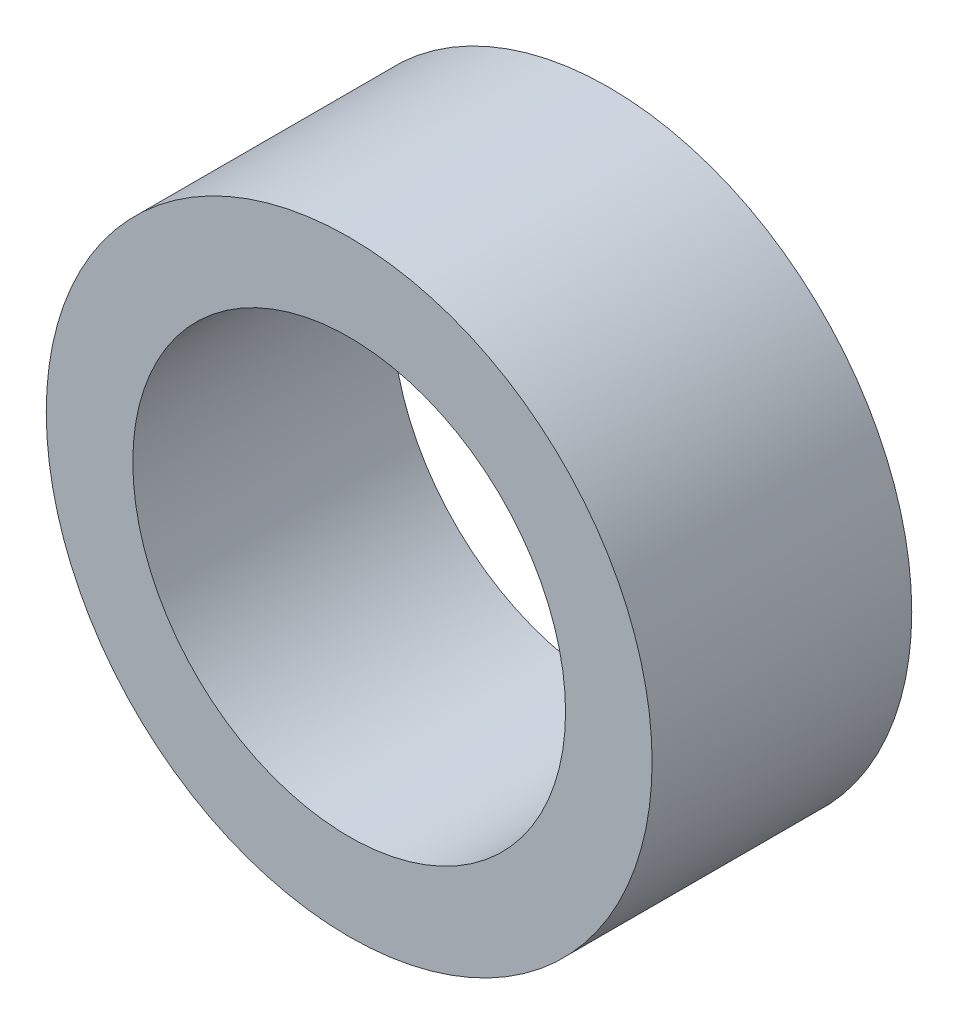
ISO-10303-21;
HEADER;
FILE_DESCRIPTION(('STEP AP214'),'2;1');
FILE_NAME('part.step','',(''),(''),'','','');
FILE_SCHEMA(('AUTOMOTIVE_DESIGN { 1 0 10303 214 1 1 1 1 }'));
ENDSEC;
DATA;
#1=APPLICATION_CONTEXT('core data for automotive mechanical design processes');
#2=APPLICATION_PROTOCOL_DEFINITION('international standard','automotive_design',2000,#1);
#3=PRODUCT_CONTEXT('',#1,'mechanical');
#4=PRODUCT('Part','Part','',(#3));
#5=PRODUCT_RELATED_PRODUCT_CATEGORY('part','',(#4));
#6=PRODUCT_DEFINITION_FORMATION('','',#4);
#7=PRODUCT_DEFINITION_CONTEXT('part definition',#1,'design');
#8=PRODUCT_DEFINITION('design','',#6,#7);
#9=PRODUCT_DEFINITION_SHAPE('','',#8);
#10=(LENGTH_UNIT() NAMED_UNIT(*) SI_UNIT(.MILLI.,.METRE.));
#11=(NAMED_UNIT(*) PLANE_ANGLE_UNIT() SI_UNIT($,.RADIAN.));
#12=(NAMED_UNIT(*) SI_UNIT($,.STERADIAN.) SOLID_ANGLE_UNIT());
#13=UNCERTAINTY_MEASURE_WITH_UNIT(LENGTH_MEASURE(1.E-05),#10,'distance_accuracy_value','');
#14=(GEOMETRIC_REPRESENTATION_CONTEXT(3) GLOBAL_UNCERTAINTY_ASSIGNED_CONTEXT((#13)) GLOBAL_UNIT_ASSIGNED_CONTEXT((#10,
#11,#12)) REPRESENTATION_CONTEXT('',''));
#15=CARTESIAN_POINT('',(0.,0.,0.));
#16=DIRECTION('',(0.,0.,1.));
#17=DIRECTION('',(1.,0.,0.));
#18=AXIS2_PLACEMENT_3D('',#15,#16,#17);
#19=CARTESIAN_POINT('',(0.,0.,3.));
#20=DIRECTION('',(0.,0.,1.));
#21=DIRECTION('',(1.,0.,0.));
#22=AXIS2_PLACEMENT_3D('',#19,#20,#21);
#23=PLANE('',#22);
#24=CARTESIAN_POINT('',(0.,0.,3.));
#25=DIRECTION('',(0.,0.,1.));
#26=DIRECTION('',(1.,0.,0.));
#27=AXIS2_PLACEMENT_3D('',#24,#25,#26);
#28=CIRCLE('',#27,3.5);
#29=CARTESIAN_POINT('',(3.5,0.,3.));
#30=VERTEX_POINT('',#29);
#31=EDGE_CURVE('E10',#30,#30,#28,.T.);
#32=ORIENTED_EDGE('',*,*,#31,.T.);
#33=EDGE_LOOP('',(#32));
#34=FACE_BOUND('',#33,.T.);
#35=CARTESIAN_POINT('',(0.,0.,3.));
#36=DIRECTION('',(0.,0.,1.));
#37=DIRECTION('',(1.,0.,0.));
#38=AXIS2_PLACEMENT_3D('',#35,#36,#37);
#39=CIRCLE('',#38,2.5);
#40=CARTESIAN_POINT('',(2.5,0.,3.));
#41=VERTEX_POINT('',#40);
#42=EDGE_CURVE('E50',#41,#41,#39,.T.);
#43=ORIENTED_EDGE('',*,*,#42,.F.);
#44=EDGE_LOOP('',(#43));
#45=FACE_BOUND('',#44,.T.);
#46=ADVANCED_FACE('F37',(#34,#45),#23,.T.);
#47=CARTESIAN_POINT('',(0.,0.,0.));
#48=DIRECTION('',(0.,0.,1.));
#49=DIRECTION('',(1.,0.,0.));
#50=AXIS2_PLACEMENT_3D('',#47,#48,#49);
#51=PLANE('',#50);
#52=CARTESIAN_POINT('',(0.,0.,0.));
#53=DIRECTION('',(0.,0.,1.));
#54=DIRECTION('',(1.,0.,0.));
#55=AXIS2_PLACEMENT_3D('',#52,#53,#54);
#56=CIRCLE('',#55,3.5);
#57=CARTESIAN_POINT('',(3.5,0.,0.));
#58=VERTEX_POINT('',#57);
#59=EDGE_CURVE('E41',#58,#58,#56,.T.);
#60=ORIENTED_EDGE('',*,*,#59,.F.);
#61=EDGE_LOOP('',(#60));
#62=FACE_BOUND('',#61,.T.);
#63=CARTESIAN_POINT('',(0.,0.,0.));
#64=DIRECTION('',(0.,0.,1.));
#65=DIRECTION('',(1.,0.,0.));
#66=AXIS2_PLACEMENT_3D('',#63,#64,#65);
#67=CIRCLE('',#66,2.5);
#68=CARTESIAN_POINT('',(2.5,0.,0.));
#69=VERTEX_POINT('',#68);
#70=EDGE_CURVE('E52',#69,#69,#67,.T.);
#71=ORIENTED_EDGE('',*,*,#70,.T.);
#72=EDGE_LOOP('',(#71));
#73=FACE_BOUND('',#72,.T.);
#74=ADVANCED_FACE('F64',(#62,#73),#51,.F.);
#75=CARTESIAN_POINT('',(0.,0.,3.));
#76=DIRECTION('',(0.,0.,-1.));
#77=DIRECTION('',(-1.,0.,0.));
#78=AXIS2_PLACEMENT_3D('',#75,#76,#77);
#79=CYLINDRICAL_SURFACE('',#78,3.5);
#80=ORIENTED_EDGE('',*,*,#31,.F.);
#81=EDGE_LOOP('',(#80));
#82=FACE_BOUND('',#81,.T.);
#83=ORIENTED_EDGE('',*,*,#59,.T.);
#84=EDGE_LOOP('',(#83));
#85=FACE_BOUND('',#84,.T.);
#86=ADVANCED_FACE('F39',(#82,#85),#79,.T.);
#87=CARTESIAN_POINT('',(0.,0.,3.));
#88=DIRECTION('',(0.,0.,-1.));
#89=DIRECTION('',(-1.,0.,0.));
#90=AXIS2_PLACEMENT_3D('',#87,#88,#89);
#91=CYLINDRICAL_SURFACE('',#90,2.5);
#92=ORIENTED_EDGE('',*,*,#42,.T.);
#93=EDGE_LOOP('',(#92));
#94=FACE_BOUND('',#93,.T.);
#95=ORIENTED_EDGE('',*,*,#70,.F.);
#96=EDGE_LOOP('',(#95));
#97=FACE_BOUND('',#96,.T.);
#98=ADVANCED_FACE('F60',(#94,#97),#91,.F.);
#99=CLOSED_SHELL('',(#46,#74,#86,#98));
#100=MANIFOLD_SOLID_BREP('B2',#99);
#101=ADVANCED_BREP_SHAPE_REPRESENTATION('',(#18,#100),#14);
#102=SHAPE_DEFINITION_REPRESENTATION(#9,#101);
ENDSEC;
END-ISO-10303-21;
